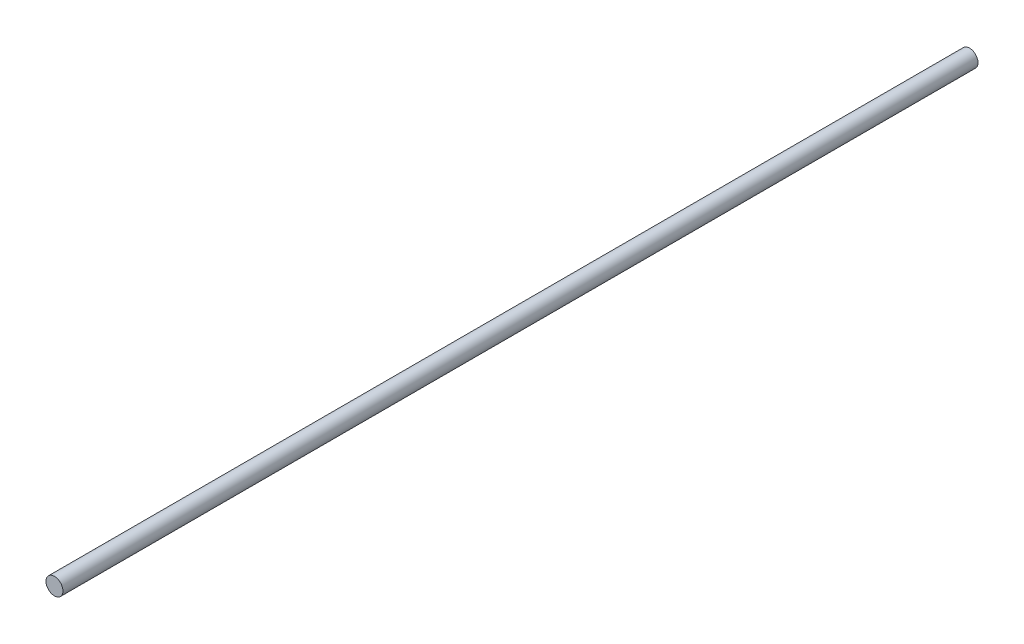
ISO-10303-21;
HEADER;
FILE_DESCRIPTION(('STEP AP214'),'2;1');
FILE_NAME('part.step','',(''),(''),'','','');
FILE_SCHEMA(('AUTOMOTIVE_DESIGN { 1 0 10303 214 1 1 1 1 }'));
ENDSEC;
DATA;
#1=APPLICATION_CONTEXT('core data for automotive mechanical design processes');
#2=APPLICATION_PROTOCOL_DEFINITION('international standard','automotive_design',2000,#1);
#3=PRODUCT_CONTEXT('',#1,'mechanical');
#4=PRODUCT('Part','Part','',(#3));
#5=PRODUCT_RELATED_PRODUCT_CATEGORY('part','',(#4));
#6=PRODUCT_DEFINITION_FORMATION('','',#4);
#7=PRODUCT_DEFINITION_CONTEXT('part definition',#1,'design');
#8=PRODUCT_DEFINITION('design','',#6,#7);
#9=PRODUCT_DEFINITION_SHAPE('','',#8);
#10=(LENGTH_UNIT() NAMED_UNIT(*) SI_UNIT(.MILLI.,.METRE.));
#11=(NAMED_UNIT(*) PLANE_ANGLE_UNIT() SI_UNIT($,.RADIAN.));
#12=(NAMED_UNIT(*) SI_UNIT($,.STERADIAN.) SOLID_ANGLE_UNIT());
#13=UNCERTAINTY_MEASURE_WITH_UNIT(LENGTH_MEASURE(1.E-05),#10,'distance_accuracy_value','');
#14=(GEOMETRIC_REPRESENTATION_CONTEXT(3) GLOBAL_UNCERTAINTY_ASSIGNED_CONTEXT((#13)) GLOBAL_UNIT_ASSIGNED_CONTEXT((#10,
#11,#12)) REPRESENTATION_CONTEXT('',''));
#15=CARTESIAN_POINT('',(0.,0.,0.));
#16=DIRECTION('',(0.,0.,1.));
#17=DIRECTION('',(1.,0.,0.));
#18=AXIS2_PLACEMENT_3D('',#15,#16,#17);
#19=CARTESIAN_POINT('',(0.,0.,323.71));
#20=DIRECTION('',(0.,0.,-1.));
#21=DIRECTION('',(-1.,0.,0.));
#22=AXIS2_PLACEMENT_3D('',#19,#20,#21);
#23=CYLINDRICAL_SURFACE('',#22,3.);
#24=CARTESIAN_POINT('',(0.,0.,323.71));
#25=DIRECTION('',(0.,0.,1.));
#26=DIRECTION('',(1.,0.,0.));
#27=AXIS2_PLACEMENT_3D('',#24,#25,#26);
#28=CIRCLE('',#27,3.);
#29=CARTESIAN_POINT('',(3.,0.,323.71));
#30=VERTEX_POINT('',#29);
#31=EDGE_CURVE('E10',#30,#30,#28,.T.);
#32=ORIENTED_EDGE('',*,*,#31,.F.);
#33=EDGE_LOOP('',(#32));
#34=FACE_BOUND('',#33,.T.);
#35=CARTESIAN_POINT('',(0.,0.,0.));
#36=DIRECTION('',(0.,0.,1.));
#37=DIRECTION('',(1.,0.,0.));
#38=AXIS2_PLACEMENT_3D('',#35,#36,#37);
#39=CIRCLE('',#38,3.);
#40=CARTESIAN_POINT('',(3.,0.,0.));
#41=VERTEX_POINT('',#40);
#42=EDGE_CURVE('E40',#41,#41,#39,.T.);
#43=ORIENTED_EDGE('',*,*,#42,.T.);
#44=EDGE_LOOP('',(#43));
#45=FACE_BOUND('',#44,.T.);
#46=ADVANCED_FACE('F37',(#34,#45),#23,.T.);
#47=CARTESIAN_POINT('',(0.,0.,323.71));
#48=DIRECTION('',(0.,0.,1.));
#49=DIRECTION('',(1.,0.,0.));
#50=AXIS2_PLACEMENT_3D('',#47,#48,#49);
#51=PLANE('',#50);
#52=ORIENTED_EDGE('',*,*,#31,.T.);
#53=EDGE_LOOP('',(#52));
#54=FACE_BOUND('',#53,.T.);
#55=ADVANCED_FACE('F52',(#54),#51,.T.);
#56=CARTESIAN_POINT('',(0.,0.,0.));
#57=DIRECTION('',(0.,0.,1.));
#58=DIRECTION('',(1.,0.,0.));
#59=AXIS2_PLACEMENT_3D('',#56,#57,#58);
#60=PLANE('',#59);
#61=ORIENTED_EDGE('',*,*,#42,.F.);
#62=EDGE_LOOP('',(#61));
#63=FACE_BOUND('',#62,.T.);
#64=ADVANCED_FACE('F50',(#63),#60,.F.);
#65=CLOSED_SHELL('',(#46,#55,#64));
#66=MANIFOLD_SOLID_BREP('B2',#65);
#67=ADVANCED_BREP_SHAPE_REPRESENTATION('',(#18,#66),#14);
#68=SHAPE_DEFINITION_REPRESENTATION(#9,#67);
ENDSEC;
END-ISO-10303-21;
